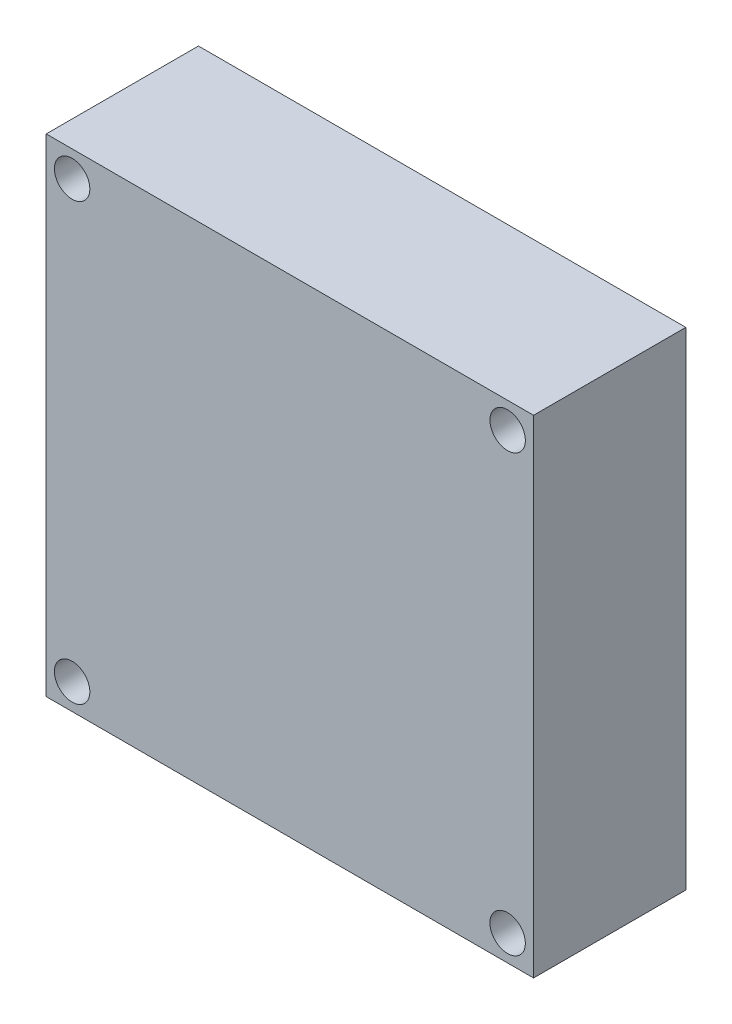
ISO-10303-21;
HEADER;
FILE_DESCRIPTION(('STEP AP214'),'2;1');
FILE_NAME('part.step','',(''),(''),'','','');
FILE_SCHEMA(('AUTOMOTIVE_DESIGN { 1 0 10303 214 1 1 1 1 }'));
ENDSEC;
DATA;
#1=APPLICATION_CONTEXT('core data for automotive mechanical design processes');
#2=APPLICATION_PROTOCOL_DEFINITION('international standard','automotive_design',2000,#1);
#3=PRODUCT_CONTEXT('',#1,'mechanical');
#4=PRODUCT('Part','Part','',(#3));
#5=PRODUCT_RELATED_PRODUCT_CATEGORY('part','',(#4));
#6=PRODUCT_DEFINITION_FORMATION('','',#4);
#7=PRODUCT_DEFINITION_CONTEXT('part definition',#1,'design');
#8=PRODUCT_DEFINITION('design','',#6,#7);
#9=PRODUCT_DEFINITION_SHAPE('','',#8);
#10=(LENGTH_UNIT() NAMED_UNIT(*) SI_UNIT(.MILLI.,.METRE.));
#11=(NAMED_UNIT(*) PLANE_ANGLE_UNIT() SI_UNIT($,.RADIAN.));
#12=(NAMED_UNIT(*) SI_UNIT($,.STERADIAN.) SOLID_ANGLE_UNIT());
#13=UNCERTAINTY_MEASURE_WITH_UNIT(LENGTH_MEASURE(1.E-05),#10,'distance_accuracy_value','');
#14=(GEOMETRIC_REPRESENTATION_CONTEXT(3) GLOBAL_UNCERTAINTY_ASSIGNED_CONTEXT((#13)) GLOBAL_UNIT_ASSIGNED_CONTEXT((#10,
#11,#12)) REPRESENTATION_CONTEXT('',''));
#15=CARTESIAN_POINT('',(0.,0.,0.));
#16=DIRECTION('',(0.,0.,1.));
#17=DIRECTION('',(1.,0.,0.));
#18=AXIS2_PLACEMENT_3D('',#15,#16,#17);
#19=CARTESIAN_POINT('',(0.,0.,24.9936));
#20=DIRECTION('',(0.,0.,-1.));
#21=DIRECTION('',(-1.,0.,0.));
#22=AXIS2_PLACEMENT_3D('',#19,#20,#21);
#23=PLANE('',#22);
#24=CARTESIAN_POINT('',(35.7505,35.7505,24.9936));
#25=DIRECTION('',(0.,0.,1.));
#26=DIRECTION('',(1.,0.,0.));
#27=AXIS2_PLACEMENT_3D('',#24,#25,#26);
#28=CIRCLE('',#27,2.9083);
#29=CARTESIAN_POINT('',(38.6588,35.7505,24.9936));
#30=VERTEX_POINT('',#29);
#31=EDGE_CURVE('E147',#30,#30,#28,.T.);
#32=ORIENTED_EDGE('',*,*,#31,.F.);
#33=EDGE_LOOP('',(#32));
#34=FACE_BOUND('',#33,.T.);
#35=CARTESIAN_POINT('',(-35.7505,35.7505,24.9936));
#36=DIRECTION('',(0.,0.,1.));
#37=DIRECTION('',(1.,0.,0.));
#38=AXIS2_PLACEMENT_3D('',#35,#36,#37);
#39=CIRCLE('',#38,2.9083);
#40=CARTESIAN_POINT('',(-32.8422,35.7505,24.9936));
#41=VERTEX_POINT('',#40);
#42=EDGE_CURVE('E130',#41,#41,#39,.T.);
#43=ORIENTED_EDGE('',*,*,#42,.F.);
#44=EDGE_LOOP('',(#43));
#45=FACE_BOUND('',#44,.T.);
#46=DIRECTION('',(0.,1.,0.));
#47=VECTOR('',#46,1.);
#48=CARTESIAN_POINT('',(40.005,-40.005,24.9936));
#49=LINE('',#48,#47);
#50=CARTESIAN_POINT('',(40.005,-40.005,24.9936));
#51=VERTEX_POINT('',#50);
#52=CARTESIAN_POINT('',(40.005,40.005,24.9936));
#53=VERTEX_POINT('',#52);
#54=EDGE_CURVE('E92',#51,#53,#49,.T.);
#55=ORIENTED_EDGE('',*,*,#54,.T.);
#56=DIRECTION('',(-1.,0.,0.));
#57=VECTOR('',#56,1.);
#58=CARTESIAN_POINT('',(-40.005,40.005,24.9936));
#59=LINE('',#58,#57);
#60=CARTESIAN_POINT('',(-40.005,40.005,24.9936));
#61=VERTEX_POINT('',#60);
#62=EDGE_CURVE('E87',#53,#61,#59,.T.);
#63=ORIENTED_EDGE('',*,*,#62,.T.);
#64=DIRECTION('',(0.,-1.,0.));
#65=VECTOR('',#64,1.);
#66=CARTESIAN_POINT('',(-40.005,-40.005,24.9936));
#67=LINE('',#66,#65);
#68=CARTESIAN_POINT('',(-40.005,-40.005,24.9936));
#69=VERTEX_POINT('',#68);
#70=EDGE_CURVE('E90',#61,#69,#67,.T.);
#71=ORIENTED_EDGE('',*,*,#70,.T.);
#72=DIRECTION('',(1.,0.,0.));
#73=VECTOR('',#72,1.);
#74=CARTESIAN_POINT('',(-40.005,-40.005,24.9936));
#75=LINE('',#74,#73);
#76=EDGE_CURVE('E57',#69,#51,#75,.T.);
#77=ORIENTED_EDGE('',*,*,#76,.T.);
#78=EDGE_LOOP('',(#55,#63,#71,#77));
#79=FACE_BOUND('',#78,.T.);
#80=CARTESIAN_POINT('',(35.7505,-35.7505,24.9936));
#81=DIRECTION('',(0.,0.,1.));
#82=DIRECTION('',(1.,0.,0.));
#83=AXIS2_PLACEMENT_3D('',#80,#81,#82);
#84=CIRCLE('',#83,2.9083);
#85=CARTESIAN_POINT('',(38.6588,-35.7505,24.9936));
#86=VERTEX_POINT('',#85);
#87=EDGE_CURVE('E154',#86,#86,#84,.F.);
#88=ORIENTED_EDGE('',*,*,#87,.T.);
#89=EDGE_LOOP('',(#88));
#90=FACE_BOUND('',#89,.T.);
#91=CARTESIAN_POINT('',(-35.7505,-35.7505,24.9936));
#92=DIRECTION('',(0.,0.,1.));
#93=DIRECTION('',(1.,0.,0.));
#94=AXIS2_PLACEMENT_3D('',#91,#92,#93);
#95=CIRCLE('',#94,2.9083);
#96=CARTESIAN_POINT('',(-32.8422,-35.7505,24.9936));
#97=VERTEX_POINT('',#96);
#98=EDGE_CURVE('E138',#97,#97,#95,.F.);
#99=ORIENTED_EDGE('',*,*,#98,.T.);
#100=EDGE_LOOP('',(#99));
#101=FACE_BOUND('',#100,.T.);
#102=ADVANCED_FACE('F39',(#34,#45,#79,#90,#101),#23,.F.);
#103=CARTESIAN_POINT('',(0.,0.,0.));
#104=DIRECTION('',(0.,0.,-1.));
#105=DIRECTION('',(-1.,0.,0.));
#106=AXIS2_PLACEMENT_3D('',#103,#104,#105);
#107=PLANE('',#106);
#108=CARTESIAN_POINT('',(35.7505,35.7505,0.));
#109=DIRECTION('',(0.,0.,1.));
#110=DIRECTION('',(1.,0.,0.));
#111=AXIS2_PLACEMENT_3D('',#108,#109,#110);
#112=CIRCLE('',#111,2.9083);
#113=CARTESIAN_POINT('',(38.6588,35.7505,0.));
#114=VERTEX_POINT('',#113);
#115=EDGE_CURVE('E134',#114,#114,#112,.T.);
#116=ORIENTED_EDGE('',*,*,#115,.T.);
#117=EDGE_LOOP('',(#116));
#118=FACE_BOUND('',#117,.T.);
#119=CARTESIAN_POINT('',(35.7505,-35.7505,0.));
#120=DIRECTION('',(0.,0.,1.));
#121=DIRECTION('',(1.,0.,0.));
#122=AXIS2_PLACEMENT_3D('',#119,#120,#121);
#123=CIRCLE('',#122,2.9083);
#124=CARTESIAN_POINT('',(38.6588,-35.7505,0.));
#125=VERTEX_POINT('',#124);
#126=EDGE_CURVE('E143',#125,#125,#123,.F.);
#127=ORIENTED_EDGE('',*,*,#126,.F.);
#128=EDGE_LOOP('',(#127));
#129=FACE_BOUND('',#128,.T.);
#130=CARTESIAN_POINT('',(-35.7505,35.7505,0.));
#131=DIRECTION('',(0.,0.,1.));
#132=DIRECTION('',(1.,0.,0.));
#133=AXIS2_PLACEMENT_3D('',#130,#131,#132);
#134=CIRCLE('',#133,2.9083);
#135=CARTESIAN_POINT('',(-32.8422,35.7505,0.));
#136=VERTEX_POINT('',#135);
#137=EDGE_CURVE('E112',#136,#136,#134,.T.);
#138=ORIENTED_EDGE('',*,*,#137,.T.);
#139=EDGE_LOOP('',(#138));
#140=FACE_BOUND('',#139,.T.);
#141=DIRECTION('',(0.,1.,0.));
#142=VECTOR('',#141,1.);
#143=CARTESIAN_POINT('',(40.005,-40.005,0.));
#144=LINE('',#143,#142);
#145=CARTESIAN_POINT('',(40.005,-40.005,0.));
#146=VERTEX_POINT('',#145);
#147=CARTESIAN_POINT('',(40.005,40.005,0.));
#148=VERTEX_POINT('',#147);
#149=EDGE_CURVE('E108',#146,#148,#144,.T.);
#150=ORIENTED_EDGE('',*,*,#149,.F.);
#151=DIRECTION('',(1.,0.,0.));
#152=VECTOR('',#151,1.);
#153=CARTESIAN_POINT('',(-40.005,-40.005,0.));
#154=LINE('',#153,#152);
#155=CARTESIAN_POINT('',(-40.005,-40.005,0.));
#156=VERTEX_POINT('',#155);
#157=EDGE_CURVE('E80',#156,#146,#154,.T.);
#158=ORIENTED_EDGE('',*,*,#157,.F.);
#159=DIRECTION('',(0.,-1.,0.));
#160=VECTOR('',#159,1.);
#161=CARTESIAN_POINT('',(-40.005,-40.005,0.));
#162=LINE('',#161,#160);
#163=CARTESIAN_POINT('',(-40.005,40.005,0.));
#164=VERTEX_POINT('',#163);
#165=EDGE_CURVE('E74',#164,#156,#162,.T.);
#166=ORIENTED_EDGE('',*,*,#165,.F.);
#167=DIRECTION('',(-1.,0.,0.));
#168=VECTOR('',#167,1.);
#169=CARTESIAN_POINT('',(-40.005,40.005,0.));
#170=LINE('',#169,#168);
#171=EDGE_CURVE('E97',#148,#164,#170,.T.);
#172=ORIENTED_EDGE('',*,*,#171,.F.);
#173=EDGE_LOOP('',(#150,#158,#166,#172));
#174=FACE_BOUND('',#173,.T.);
#175=CARTESIAN_POINT('',(-35.7505,-35.7505,0.));
#176=DIRECTION('',(0.,0.,1.));
#177=DIRECTION('',(1.,0.,0.));
#178=AXIS2_PLACEMENT_3D('',#175,#176,#177);
#179=CIRCLE('',#178,2.9083);
#180=CARTESIAN_POINT('',(-32.8422,-35.7505,0.));
#181=VERTEX_POINT('',#180);
#182=EDGE_CURVE('E142',#181,#181,#179,.F.);
#183=ORIENTED_EDGE('',*,*,#182,.F.);
#184=EDGE_LOOP('',(#183));
#185=FACE_BOUND('',#184,.T.);
#186=ADVANCED_FACE('F125',(#118,#129,#140,#174,#185),#107,.T.);
#187=CARTESIAN_POINT('',(40.005,-40.005,24.9936));
#188=DIRECTION('',(-1.,0.,0.));
#189=DIRECTION('',(0.,0.,1.));
#190=AXIS2_PLACEMENT_3D('',#187,#188,#189);
#191=PLANE('',#190);
#192=ORIENTED_EDGE('',*,*,#149,.T.);
#193=DIRECTION('',(0.,0.,-1.));
#194=VECTOR('',#193,1.);
#195=CARTESIAN_POINT('',(40.005,40.005,24.9936));
#196=LINE('',#195,#194);
#197=EDGE_CURVE('E11',#53,#148,#196,.T.);
#198=ORIENTED_EDGE('',*,*,#197,.F.);
#199=ORIENTED_EDGE('',*,*,#54,.F.);
#200=DIRECTION('',(0.,0.,-1.));
#201=VECTOR('',#200,1.);
#202=CARTESIAN_POINT('',(40.005,-40.005,24.9936));
#203=LINE('',#202,#201);
#204=EDGE_CURVE('E104',#51,#146,#203,.T.);
#205=ORIENTED_EDGE('',*,*,#204,.T.);
#206=EDGE_LOOP('',(#192,#198,#199,#205));
#207=FACE_BOUND('',#206,.T.);
#208=ADVANCED_FACE('F41',(#207),#191,.F.);
#209=CARTESIAN_POINT('',(-40.005,40.005,24.9936));
#210=DIRECTION('',(0.,-1.,0.));
#211=DIRECTION('',(0.,0.,-1.));
#212=AXIS2_PLACEMENT_3D('',#209,#210,#211);
#213=PLANE('',#212);
#214=ORIENTED_EDGE('',*,*,#171,.T.);
#215=DIRECTION('',(0.,0.,-1.));
#216=VECTOR('',#215,1.);
#217=CARTESIAN_POINT('',(-40.005,40.005,24.9936));
#218=LINE('',#217,#216);
#219=EDGE_CURVE('E49',#61,#164,#218,.T.);
#220=ORIENTED_EDGE('',*,*,#219,.F.);
#221=ORIENTED_EDGE('',*,*,#62,.F.);
#222=ORIENTED_EDGE('',*,*,#197,.T.);
#223=EDGE_LOOP('',(#214,#220,#221,#222));
#224=FACE_BOUND('',#223,.T.);
#225=ADVANCED_FACE('F96',(#224),#213,.F.);
#226=CARTESIAN_POINT('',(-40.005,-40.005,24.9936));
#227=DIRECTION('',(1.,0.,0.));
#228=DIRECTION('',(0.,0.,-1.));
#229=AXIS2_PLACEMENT_3D('',#226,#227,#228);
#230=PLANE('',#229);
#231=ORIENTED_EDGE('',*,*,#165,.T.);
#232=DIRECTION('',(0.,0.,-1.));
#233=VECTOR('',#232,1.);
#234=CARTESIAN_POINT('',(-40.005,-40.005,24.9936));
#235=LINE('',#234,#233);
#236=EDGE_CURVE('E99',#69,#156,#235,.T.);
#237=ORIENTED_EDGE('',*,*,#236,.F.);
#238=ORIENTED_EDGE('',*,*,#70,.F.);
#239=ORIENTED_EDGE('',*,*,#219,.T.);
#240=EDGE_LOOP('',(#231,#237,#238,#239));
#241=FACE_BOUND('',#240,.T.);
#242=ADVANCED_FACE('F100',(#241),#230,.F.);
#243=CARTESIAN_POINT('',(-40.005,-40.005,24.9936));
#244=DIRECTION('',(0.,1.,0.));
#245=DIRECTION('',(0.,0.,1.));
#246=AXIS2_PLACEMENT_3D('',#243,#244,#245);
#247=PLANE('',#246);
#248=ORIENTED_EDGE('',*,*,#157,.T.);
#249=ORIENTED_EDGE('',*,*,#204,.F.);
#250=ORIENTED_EDGE('',*,*,#76,.F.);
#251=ORIENTED_EDGE('',*,*,#236,.T.);
#252=EDGE_LOOP('',(#248,#249,#250,#251));
#253=FACE_BOUND('',#252,.T.);
#254=ADVANCED_FACE('F122',(#253),#247,.F.);
#255=CARTESIAN_POINT('',(-35.7505,35.7505,0.));
#256=DIRECTION('',(0.,0.,1.));
#257=DIRECTION('',(1.,0.,0.));
#258=AXIS2_PLACEMENT_3D('',#255,#256,#257);
#259=CYLINDRICAL_SURFACE('',#258,2.9083);
#260=ORIENTED_EDGE('',*,*,#137,.F.);
#261=EDGE_LOOP('',(#260));
#262=FACE_BOUND('',#261,.T.);
#263=ORIENTED_EDGE('',*,*,#42,.T.);
#264=EDGE_LOOP('',(#263));
#265=FACE_BOUND('',#264,.T.);
#266=ADVANCED_FACE('F171',(#262,#265),#259,.F.);
#267=CARTESIAN_POINT('',(35.7505,-35.7505,0.));
#268=DIRECTION('',(0.,0.,1.));
#269=DIRECTION('',(1.,0.,0.));
#270=AXIS2_PLACEMENT_3D('',#267,#268,#269);
#271=CYLINDRICAL_SURFACE('',#270,2.9083);
#272=ORIENTED_EDGE('',*,*,#126,.T.);
#273=EDGE_LOOP('',(#272));
#274=FACE_BOUND('',#273,.T.);
#275=ORIENTED_EDGE('',*,*,#87,.F.);
#276=EDGE_LOOP('',(#275));
#277=FACE_BOUND('',#276,.T.);
#278=ADVANCED_FACE('F162',(#274,#277),#271,.F.);
#279=CARTESIAN_POINT('',(-35.7505,-35.7505,0.));
#280=DIRECTION('',(0.,0.,1.));
#281=DIRECTION('',(1.,0.,0.));
#282=AXIS2_PLACEMENT_3D('',#279,#280,#281);
#283=CYLINDRICAL_SURFACE('',#282,2.9083);
#284=ORIENTED_EDGE('',*,*,#182,.T.);
#285=EDGE_LOOP('',(#284));
#286=FACE_BOUND('',#285,.T.);
#287=ORIENTED_EDGE('',*,*,#98,.F.);
#288=EDGE_LOOP('',(#287));
#289=FACE_BOUND('',#288,.T.);
#290=ADVANCED_FACE('F217',(#286,#289),#283,.F.);
#291=CARTESIAN_POINT('',(35.7505,35.7505,0.));
#292=DIRECTION('',(0.,0.,1.));
#293=DIRECTION('',(1.,0.,0.));
#294=AXIS2_PLACEMENT_3D('',#291,#292,#293);
#295=CYLINDRICAL_SURFACE('',#294,2.9083);
#296=ORIENTED_EDGE('',*,*,#115,.F.);
#297=EDGE_LOOP('',(#296));
#298=FACE_BOUND('',#297,.T.);
#299=ORIENTED_EDGE('',*,*,#31,.T.);
#300=EDGE_LOOP('',(#299));
#301=FACE_BOUND('',#300,.T.);
#302=ADVANCED_FACE('F226',(#298,#301),#295,.F.);
#303=CLOSED_SHELL('',(#102,#186,#208,#225,#242,#254,#266,#278,#290,#302));
#304=MANIFOLD_SOLID_BREP('B2',#303);
#305=ADVANCED_BREP_SHAPE_REPRESENTATION('',(#18,#304),#14);
#306=SHAPE_DEFINITION_REPRESENTATION(#9,#305);
ENDSEC;
END-ISO-10303-21;
